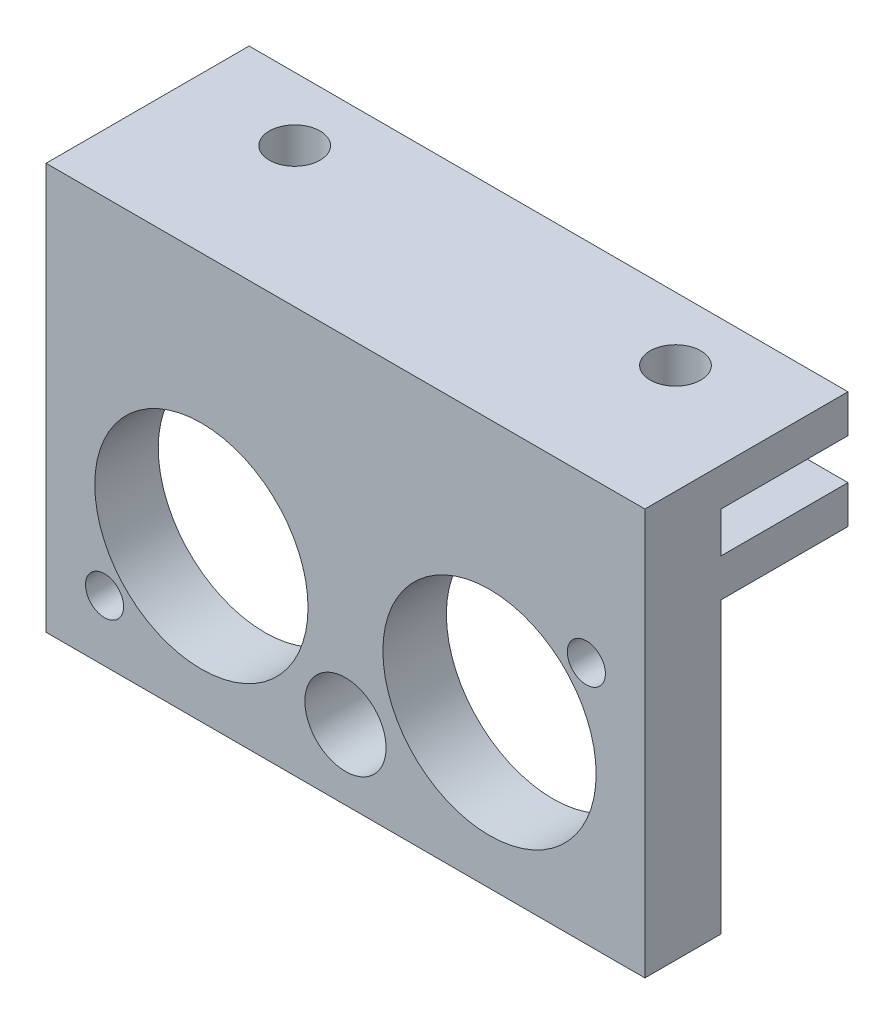
ISO-10303-21;
HEADER;
FILE_DESCRIPTION(('STEP AP214'),'2;1');
FILE_NAME('part.step','',(''),(''),'','','');
FILE_SCHEMA(('AUTOMOTIVE_DESIGN { 1 0 10303 214 1 1 1 1 }'));
ENDSEC;
DATA;
#1=APPLICATION_CONTEXT('core data for automotive mechanical design processes');
#2=APPLICATION_PROTOCOL_DEFINITION('international standard','automotive_design',2000,#1);
#3=PRODUCT_CONTEXT('',#1,'mechanical');
#4=PRODUCT('Part','Part','',(#3));
#5=PRODUCT_RELATED_PRODUCT_CATEGORY('part','',(#4));
#6=PRODUCT_DEFINITION_FORMATION('','',#4);
#7=PRODUCT_DEFINITION_CONTEXT('part definition',#1,'design');
#8=PRODUCT_DEFINITION('design','',#6,#7);
#9=PRODUCT_DEFINITION_SHAPE('','',#8);
#10=(LENGTH_UNIT() NAMED_UNIT(*) SI_UNIT(.MILLI.,.METRE.));
#11=(NAMED_UNIT(*) PLANE_ANGLE_UNIT() SI_UNIT($,.RADIAN.));
#12=(NAMED_UNIT(*) SI_UNIT($,.STERADIAN.) SOLID_ANGLE_UNIT());
#13=UNCERTAINTY_MEASURE_WITH_UNIT(LENGTH_MEASURE(1.E-05),#10,'distance_accuracy_value','');
#14=(GEOMETRIC_REPRESENTATION_CONTEXT(3) GLOBAL_UNCERTAINTY_ASSIGNED_CONTEXT((#13)) GLOBAL_UNIT_ASSIGNED_CONTEXT((#10,
#11,#12)) REPRESENTATION_CONTEXT('',''));
#15=CARTESIAN_POINT('',(0.,0.,0.));
#16=DIRECTION('',(0.,0.,1.));
#17=DIRECTION('',(1.,0.,0.));
#18=AXIS2_PLACEMENT_3D('',#15,#16,#17);
#19=CARTESIAN_POINT('',(-86.1189313630636,-26.6187031008466,2.482219341433E-13));
#20=DIRECTION('',(0.,0.,1.));
#21=DIRECTION('',(1.,0.,0.));
#22=AXIS2_PLACEMENT_3D('',#19,#20,#21);
#23=PLANE('',#22);
#24=DIRECTION('',(1.,0.,0.));
#25=VECTOR('',#24,1.);
#26=CARTESIAN_POINT('',(-88.1189313630636,-2.81870310084656,0.));
#27=LINE('',#26,#25);
#28=CARTESIAN_POINT('',(-54.5289313630636,-2.81870310084656,0.));
#29=VERTEX_POINT('',#28);
#30=CARTESIAN_POINT('',(-40.9389313630636,-2.81870310084656,2.48666185319545E-13));
#31=VERTEX_POINT('',#30);
#32=EDGE_CURVE('E365',#29,#31,#27,.T.);
#33=ORIENTED_EDGE('',*,*,#32,.F.);
#34=DIRECTION('',(0.,1.,0.));
#35=VECTOR('',#34,1.);
#36=CARTESIAN_POINT('',(-54.5289313630636,-26.6187031008466,2.482219341433E-13));
#37=LINE('',#36,#35);
#38=CARTESIAN_POINT('',(-54.5289313630636,0.381296899153442,0.));
#39=VERTEX_POINT('',#38);
#40=EDGE_CURVE('E460',#29,#39,#37,.T.);
#41=ORIENTED_EDGE('',*,*,#40,.T.);
#42=DIRECTION('',(-1.,0.,0.));
#43=VECTOR('',#42,1.);
#44=CARTESIAN_POINT('',(-40.9389313630636,0.381296899153443,0.));
#45=LINE('',#44,#43);
#46=CARTESIAN_POINT('',(-40.9389313630636,0.381296899153442,2.48666185319545E-13));
#47=VERTEX_POINT('',#46);
#48=EDGE_CURVE('E385',#47,#39,#45,.T.);
#49=ORIENTED_EDGE('',*,*,#48,.F.);
#50=DIRECTION('',(0.,-1.,0.));
#51=VECTOR('',#50,1.);
#52=CARTESIAN_POINT('',(-40.9389313630636,-28.6187031008466,2.48666185319545E-13));
#53=LINE('',#52,#51);
#54=EDGE_CURVE('E312',#47,#31,#53,.T.);
#55=ORIENTED_EDGE('',*,*,#54,.T.);
#56=EDGE_LOOP('',(#33,#41,#49,#55));
#57=FACE_BOUND('',#56,.T.);
#58=ADVANCED_FACE('F33',(#57),#23,.F.);
#59=CARTESIAN_POINT('',(-86.3189313630636,-6.41870310084656,-48.1183582429822));
#60=DIRECTION('',(0.,-1.,0.));
#61=DIRECTION('',(0.,0.,-1.));
#62=AXIS2_PLACEMENT_3D('',#59,#60,#61);
#63=PLANE('',#62);
#64=DIRECTION('',(0.,0.,1.));
#65=VECTOR('',#64,1.);
#66=CARTESIAN_POINT('',(-54.5289313630636,-6.41870310084656,1.00000000000025));
#67=LINE('',#66,#65);
#68=CARTESIAN_POINT('',(-54.5289313630636,-6.41870310084656,2.4980018054066E-13));
#69=VERTEX_POINT('',#68);
#70=CARTESIAN_POINT('',(-54.5289313630636,-6.41870310084656,1.00000000000025));
#71=VERTEX_POINT('',#70);
#72=EDGE_CURVE('E208',#69,#71,#67,.T.);
#73=ORIENTED_EDGE('',*,*,#72,.F.);
#74=DIRECTION('',(-1.,0.,0.));
#75=VECTOR('',#74,1.);
#76=CARTESIAN_POINT('',(-86.3189313630636,-6.41870310084656,2.48666185319545E-13));
#77=LINE('',#76,#75);
#78=CARTESIAN_POINT('',(-42.7389313630636,-6.41870310084656,2.48666185319545E-13));
#79=VERTEX_POINT('',#78);
#80=EDGE_CURVE('E410',#79,#69,#77,.T.);
#81=ORIENTED_EDGE('',*,*,#80,.F.);
#82=DIRECTION('',(0.,0.,1.));
#83=VECTOR('',#82,1.);
#84=CARTESIAN_POINT('',(-42.7389313630636,-6.41870310084656,-48.1183582429822));
#85=LINE('',#84,#83);
#86=CARTESIAN_POINT('',(-42.7389313630636,-6.41870310084656,1.00000000000025));
#87=VERTEX_POINT('',#86);
#88=EDGE_CURVE('E233',#79,#87,#85,.T.);
#89=ORIENTED_EDGE('',*,*,#88,.T.);
#90=DIRECTION('',(1.,0.,0.));
#91=VECTOR('',#90,1.);
#92=CARTESIAN_POINT('',(-86.3189313630636,-6.41870310084656,1.00000000000025));
#93=LINE('',#92,#91);
#94=EDGE_CURVE('E225',#71,#87,#93,.T.);
#95=ORIENTED_EDGE('',*,*,#94,.F.);
#96=EDGE_LOOP('',(#73,#81,#89,#95));
#97=FACE_BOUND('',#96,.T.);
#98=ADVANCED_FACE('F231',(#97),#63,.T.);
#99=CARTESIAN_POINT('',(-88.1189313630636,-2.81870310084656,-10.));
#100=DIRECTION('',(0.,-1.,0.));
#101=DIRECTION('',(1.,0.,0.));
#102=AXIS2_PLACEMENT_3D('',#99,#100,#101);
#103=PLANE('',#102);
#104=CARTESIAN_POINT('',(-49.5289313630636,-2.81870310084656,-4.99999999999999));
#105=DIRECTION('',(0.,-1.,0.));
#106=DIRECTION('',(1.,0.,0.));
#107=AXIS2_PLACEMENT_3D('',#104,#105,#106);
#108=CIRCLE('',#107,2.);
#109=CARTESIAN_POINT('',(-47.5289313630636,-2.81870310084656,-4.99999999999999));
#110=VERTEX_POINT('',#109);
#111=EDGE_CURVE('E479',#110,#110,#108,.T.);
#112=ORIENTED_EDGE('',*,*,#111,.T.);
#113=EDGE_LOOP('',(#112));
#114=FACE_BOUND('',#113,.T.);
#115=DIRECTION('',(1.,0.,0.));
#116=VECTOR('',#115,1.);
#117=CARTESIAN_POINT('',(-88.1189313630636,-2.81870310084656,-10.));
#118=LINE('',#117,#116);
#119=CARTESIAN_POINT('',(-54.5289313630636,-2.81870310084655,-9.99999999999999));
#120=VERTEX_POINT('',#119);
#121=CARTESIAN_POINT('',(-40.9389313630636,-2.81870310084656,-10.));
#122=VERTEX_POINT('',#121);
#123=EDGE_CURVE('E487',#120,#122,#118,.T.);
#124=ORIENTED_EDGE('',*,*,#123,.F.);
#125=DIRECTION('',(0.,0.,1.));
#126=VECTOR('',#125,1.);
#127=CARTESIAN_POINT('',(-54.5289313630636,-2.81870310084656,-10.));
#128=LINE('',#127,#126);
#129=EDGE_CURVE('E457',#120,#29,#128,.T.);
#130=ORIENTED_EDGE('',*,*,#129,.T.);
#131=ORIENTED_EDGE('',*,*,#32,.T.);
#132=DIRECTION('',(0.,0.,1.));
#133=VECTOR('',#132,1.);
#134=CARTESIAN_POINT('',(-40.9389313630636,-2.81870310084656,-10.));
#135=LINE('',#134,#133);
#136=EDGE_CURVE('E374',#122,#31,#135,.T.);
#137=ORIENTED_EDGE('',*,*,#136,.F.);
#138=EDGE_LOOP('',(#124,#130,#131,#137));
#139=FACE_BOUND('',#138,.T.);
#140=ADVANCED_FACE('F495',(#114,#139),#103,.F.);
#141=CARTESIAN_POINT('',(-88.1189313630636,-5.81870310084656,-10.));
#142=DIRECTION('',(0.,1.,0.));
#143=DIRECTION('',(-1.,0.,0.));
#144=AXIS2_PLACEMENT_3D('',#141,#142,#143);
#145=PLANE('',#144);
#146=CARTESIAN_POINT('',(-49.5289313630636,-5.81870310084656,-4.99999999999999));
#147=DIRECTION('',(0.,-1.,0.));
#148=DIRECTION('',(1.,0.,0.));
#149=AXIS2_PLACEMENT_3D('',#146,#147,#148);
#150=CIRCLE('',#149,2.);
#151=CARTESIAN_POINT('',(-47.5289313630636,-5.81870310084656,-4.99999999999999));
#152=VERTEX_POINT('',#151);
#153=EDGE_CURVE('E475',#152,#152,#150,.T.);
#154=ORIENTED_EDGE('',*,*,#153,.F.);
#155=EDGE_LOOP('',(#154));
#156=FACE_BOUND('',#155,.T.);
#157=DIRECTION('',(-1.,0.,0.));
#158=VECTOR('',#157,1.);
#159=CARTESIAN_POINT('',(-88.1189313630636,-5.81870310084656,0.));
#160=LINE('',#159,#158);
#161=CARTESIAN_POINT('',(-40.9389313630636,-5.81870310084656,0.));
#162=VERTEX_POINT('',#161);
#163=CARTESIAN_POINT('',(-54.5289313630636,-5.81870310084656,0.));
#164=VERTEX_POINT('',#163);
#165=EDGE_CURVE('E366',#162,#164,#160,.T.);
#166=ORIENTED_EDGE('',*,*,#165,.T.);
#167=DIRECTION('',(0.,0.,-1.));
#168=VECTOR('',#167,1.);
#169=CARTESIAN_POINT('',(-54.5289313630636,-5.81870310084656,-10.));
#170=LINE('',#169,#168);
#171=CARTESIAN_POINT('',(-54.5289313630636,-5.81870310084655,-9.99999999999999));
#172=VERTEX_POINT('',#171);
#173=EDGE_CURVE('E453',#164,#172,#170,.T.);
#174=ORIENTED_EDGE('',*,*,#173,.T.);
#175=DIRECTION('',(-1.,0.,0.));
#176=VECTOR('',#175,1.);
#177=CARTESIAN_POINT('',(-88.1189313630636,-5.81870310084656,-10.));
#178=LINE('',#177,#176);
#179=CARTESIAN_POINT('',(-40.9389313630636,-5.81870310084656,-10.));
#180=VERTEX_POINT('',#179);
#181=EDGE_CURVE('E356',#180,#172,#178,.T.);
#182=ORIENTED_EDGE('',*,*,#181,.F.);
#183=DIRECTION('',(0.,0.,1.));
#184=VECTOR('',#183,1.);
#185=CARTESIAN_POINT('',(-40.9389313630636,-5.81870310084656,-10.));
#186=LINE('',#185,#184);
#187=EDGE_CURVE('E371',#180,#162,#186,.T.);
#188=ORIENTED_EDGE('',*,*,#187,.T.);
#189=EDGE_LOOP('',(#166,#174,#182,#188));
#190=FACE_BOUND('',#189,.T.);
#191=ADVANCED_FACE('F504',(#156,#190),#145,.F.);
#192=CARTESIAN_POINT('',(0.,0.,-10.));
#193=DIRECTION('',(0.,0.,1.));
#194=DIRECTION('',(1.,0.,0.));
#195=AXIS2_PLACEMENT_3D('',#192,#193,#194);
#196=PLANE('',#195);
#197=ORIENTED_EDGE('',*,*,#181,.T.);
#198=DIRECTION('',(0.,1.,0.));
#199=VECTOR('',#198,1.);
#200=CARTESIAN_POINT('',(-54.5289313630636,0.,-10.));
#201=LINE('',#200,#199);
#202=EDGE_CURVE('E11',#172,#120,#201,.T.);
#203=ORIENTED_EDGE('',*,*,#202,.T.);
#204=ORIENTED_EDGE('',*,*,#123,.T.);
#205=DIRECTION('',(0.,-1.,0.));
#206=VECTOR('',#205,1.);
#207=CARTESIAN_POINT('',(-40.9389313630636,-2.81870310084656,-10.));
#208=LINE('',#207,#206);
#209=EDGE_CURVE('E357',#122,#180,#208,.T.);
#210=ORIENTED_EDGE('',*,*,#209,.T.);
#211=EDGE_LOOP('',(#197,#203,#204,#210));
#212=FACE_BOUND('',#211,.T.);
#213=ADVANCED_FACE('F491',(#212),#196,.F.);
#214=CARTESIAN_POINT('',(-74.5289313630636,0.381296899153442,0.));
#215=VERTEX_POINT('',#214);
#216=CARTESIAN_POINT('',(-88.1189313630636,0.381296899153442,0.));
#217=VERTEX_POINT('',#216);
#218=EDGE_CURVE('E380',#215,#217,#45,.T.);
#219=ORIENTED_EDGE('',*,*,#218,.F.);
#220=DIRECTION('',(0.,-1.,0.));
#221=VECTOR('',#220,1.);
#222=CARTESIAN_POINT('',(-74.5289313630636,-26.6187031008466,2.482219341433E-13));
#223=LINE('',#222,#221);
#224=CARTESIAN_POINT('',(-74.5289313630636,-2.81870310084656,0.));
#225=VERTEX_POINT('',#224);
#226=EDGE_CURVE('E451',#215,#225,#223,.T.);
#227=ORIENTED_EDGE('',*,*,#226,.T.);
#228=CARTESIAN_POINT('',(-88.1189313630636,-2.81870310084656,2.48666185319545E-13));
#229=VERTEX_POINT('',#228);
#230=EDGE_CURVE('E56',#229,#225,#27,.T.);
#231=ORIENTED_EDGE('',*,*,#230,.F.);
#232=DIRECTION('',(0.,1.,0.));
#233=VECTOR('',#232,1.);
#234=CARTESIAN_POINT('',(-88.1189313630636,-28.6187031008466,2.48666185319545E-13));
#235=LINE('',#234,#233);
#236=EDGE_CURVE('E315',#229,#217,#235,.T.);
#237=ORIENTED_EDGE('',*,*,#236,.T.);
#238=EDGE_LOOP('',(#219,#227,#231,#237));
#239=FACE_BOUND('',#238,.T.);
#240=ADVANCED_FACE('F520',(#239),#23,.F.);
#241=ORIENTED_EDGE('',*,*,#80,.T.);
#242=DIRECTION('',(0.,1.,0.));
#243=VECTOR('',#242,1.);
#244=CARTESIAN_POINT('',(-54.5289313630636,-26.6187031008466,2.482219341433E-13));
#245=LINE('',#244,#243);
#246=EDGE_CURVE('E213',#69,#164,#245,.T.);
#247=ORIENTED_EDGE('',*,*,#246,.T.);
#248=ORIENTED_EDGE('',*,*,#165,.F.);
#249=CARTESIAN_POINT('',(-40.9389313630636,-28.6187031008466,2.3478839751173E-13));
#250=VERTEX_POINT('',#249);
#251=EDGE_CURVE('E316',#162,#250,#53,.T.);
#252=ORIENTED_EDGE('',*,*,#251,.T.);
#253=DIRECTION('',(-1.,0.,0.));
#254=VECTOR('',#253,1.);
#255=CARTESIAN_POINT('',(-88.1189313630636,-28.6187031008466,2.48666185319545E-13));
#256=LINE('',#255,#254);
#257=CARTESIAN_POINT('',(-88.1189313630636,-28.6187031008466,2.48666185319545E-13));
#258=VERTEX_POINT('',#257);
#259=EDGE_CURVE('E320',#250,#258,#256,.T.);
#260=ORIENTED_EDGE('',*,*,#259,.T.);
#261=CARTESIAN_POINT('',(-88.1189313630636,-5.81870310084656,2.48666185319545E-13));
#262=VERTEX_POINT('',#261);
#263=EDGE_CURVE('E317',#258,#262,#235,.T.);
#264=ORIENTED_EDGE('',*,*,#263,.T.);
#265=CARTESIAN_POINT('',(-74.5289313630636,-5.81870310084656,0.));
#266=VERTEX_POINT('',#265);
#267=EDGE_CURVE('E364',#266,#262,#160,.T.);
#268=ORIENTED_EDGE('',*,*,#267,.F.);
#269=DIRECTION('',(0.,-1.,0.));
#270=VECTOR('',#269,1.);
#271=CARTESIAN_POINT('',(-74.5289313630636,-26.6187031008466,2.482219341433E-13));
#272=LINE('',#271,#270);
#273=CARTESIAN_POINT('',(-74.5289313630636,-6.41870310084656,2.4980018054066E-13));
#274=VERTEX_POINT('',#273);
#275=EDGE_CURVE('E446',#266,#274,#272,.T.);
#276=ORIENTED_EDGE('',*,*,#275,.T.);
#277=CARTESIAN_POINT('',(-86.3189313630636,-6.41870310084656,2.48666185319545E-13));
#278=VERTEX_POINT('',#277);
#279=EDGE_CURVE('E256',#274,#278,#77,.T.);
#280=ORIENTED_EDGE('',*,*,#279,.T.);
#281=DIRECTION('',(0.,-1.,0.));
#282=VECTOR('',#281,1.);
#283=CARTESIAN_POINT('',(-86.3189313630636,-26.8187031008466,2.48666185319545E-13));
#284=LINE('',#283,#282);
#285=CARTESIAN_POINT('',(-86.3189313630636,-26.8187031008466,2.48666185319545E-13));
#286=VERTEX_POINT('',#285);
#287=EDGE_CURVE('E412',#278,#286,#284,.T.);
#288=ORIENTED_EDGE('',*,*,#287,.T.);
#289=DIRECTION('',(1.,0.,0.));
#290=VECTOR('',#289,1.);
#291=CARTESIAN_POINT('',(-42.7389313630636,-26.8187031008466,2.48666185319545E-13));
#292=LINE('',#291,#290);
#293=CARTESIAN_POINT('',(-42.7389313630636,-26.8187031008466,2.482219341433E-13));
#294=VERTEX_POINT('',#293);
#295=EDGE_CURVE('E269',#286,#294,#292,.T.);
#296=ORIENTED_EDGE('',*,*,#295,.T.);
#297=DIRECTION('',(0.,1.,0.));
#298=VECTOR('',#297,1.);
#299=CARTESIAN_POINT('',(-42.7389313630636,-6.41870310084656,2.48666185319545E-13));
#300=LINE('',#299,#298);
#301=EDGE_CURVE('E253',#294,#79,#300,.T.);
#302=ORIENTED_EDGE('',*,*,#301,.T.);
#303=EDGE_LOOP('',(#241,#247,#248,#252,#260,#264,#268,#276,#280,#288,#296,#302));
#304=FACE_BOUND('',#303,.T.);
#305=ADVANCED_FACE('F506',(#304),#23,.F.);
#306=CARTESIAN_POINT('',(-45.5486784669612,-9.41870310084656,6.00000000000025));
#307=DIRECTION('',(0.,0.,-1.));
#308=DIRECTION('',(-1.,0.,0.));
#309=AXIS2_PLACEMENT_3D('',#306,#307,#308);
#310=CYLINDRICAL_SURFACE('',#309,1.5);
#311=CARTESIAN_POINT('',(-45.5486784669612,-9.41870310084656,6.00000000000025));
#312=DIRECTION('',(0.,0.,-1.));
#313=DIRECTION('',(-1.,0.,0.));
#314=AXIS2_PLACEMENT_3D('',#311,#312,#313);
#315=CIRCLE('',#314,1.5);
#316=CARTESIAN_POINT('',(-47.0486784669612,-9.41870310084656,6.00000000000025));
#317=VERTEX_POINT('',#316);
#318=EDGE_CURVE('E301',#317,#317,#315,.T.);
#319=ORIENTED_EDGE('',*,*,#318,.F.);
#320=EDGE_LOOP('',(#319));
#321=FACE_BOUND('',#320,.T.);
#322=CARTESIAN_POINT('',(-45.5486784669612,-9.41870310084656,1.00000000000025));
#323=DIRECTION('',(0.,0.,-1.));
#324=DIRECTION('',(-1.,0.,0.));
#325=AXIS2_PLACEMENT_3D('',#322,#323,#324);
#326=CIRCLE('',#325,1.5);
#327=CARTESIAN_POINT('',(-47.0486784669612,-9.41870310084656,1.00000000000025));
#328=VERTEX_POINT('',#327);
#329=EDGE_CURVE('E290',#328,#328,#326,.F.);
#330=ORIENTED_EDGE('',*,*,#329,.F.);
#331=EDGE_LOOP('',(#330));
#332=FACE_BOUND('',#331,.T.);
#333=ADVANCED_FACE('F528',(#321,#332),#310,.F.);
#334=CARTESIAN_POINT('',(-83.5091842591659,-23.8187031008466,6.00000000000025));
#335=DIRECTION('',(0.,0.,-1.));
#336=DIRECTION('',(-1.,0.,0.));
#337=AXIS2_PLACEMENT_3D('',#334,#335,#336);
#338=CYLINDRICAL_SURFACE('',#337,1.5);
#339=CARTESIAN_POINT('',(-83.5091842591659,-23.8187031008466,6.00000000000025));
#340=DIRECTION('',(0.,0.,-1.));
#341=DIRECTION('',(-1.,0.,0.));
#342=AXIS2_PLACEMENT_3D('',#339,#340,#341);
#343=CIRCLE('',#342,1.5);
#344=CARTESIAN_POINT('',(-85.0091842591659,-23.8187031008466,6.00000000000025));
#345=VERTEX_POINT('',#344);
#346=EDGE_CURVE('E307',#345,#345,#343,.T.);
#347=ORIENTED_EDGE('',*,*,#346,.F.);
#348=EDGE_LOOP('',(#347));
#349=FACE_BOUND('',#348,.T.);
#350=CARTESIAN_POINT('',(-83.5091842591659,-23.8187031008466,1.00000000000025));
#351=DIRECTION('',(0.,0.,-1.));
#352=DIRECTION('',(-1.,0.,0.));
#353=AXIS2_PLACEMENT_3D('',#350,#351,#352);
#354=CIRCLE('',#353,1.5);
#355=CARTESIAN_POINT('',(-85.0091842591659,-23.8187031008466,1.00000000000025));
#356=VERTEX_POINT('',#355);
#357=EDGE_CURVE('E291',#356,#356,#354,.F.);
#358=ORIENTED_EDGE('',*,*,#357,.F.);
#359=EDGE_LOOP('',(#358));
#360=FACE_BOUND('',#359,.T.);
#361=ADVANCED_FACE('F639',(#349,#360),#338,.F.);
#362=CARTESIAN_POINT('',(-88.1189313630636,-28.6187031008466,-52.9334714523804));
#363=DIRECTION('',(-1.,0.,0.));
#364=DIRECTION('',(0.,0.,1.));
#365=AXIS2_PLACEMENT_3D('',#362,#363,#364);
#366=PLANE('',#365);
#367=ORIENTED_EDGE('',*,*,#263,.F.);
#368=DIRECTION('',(0.,0.,1.));
#369=VECTOR('',#368,1.);
#370=CARTESIAN_POINT('',(-88.1189313630636,-28.6187031008466,-52.9334714523804));
#371=LINE('',#370,#369);
#372=CARTESIAN_POINT('',(-88.1189313630636,-28.6187031008466,6.00000000000025));
#373=VERTEX_POINT('',#372);
#374=EDGE_CURVE('E328',#258,#373,#371,.T.);
#375=ORIENTED_EDGE('',*,*,#374,.T.);
#376=DIRECTION('',(0.,-1.,0.));
#377=VECTOR('',#376,1.);
#378=CARTESIAN_POINT('',(-88.1189313630636,-28.6187031008466,6.00000000000025));
#379=LINE('',#378,#377);
#380=CARTESIAN_POINT('',(-88.1189313630636,3.38129689915344,6.00000000000025));
#381=VERTEX_POINT('',#380);
#382=EDGE_CURVE('E310',#381,#373,#379,.T.);
#383=ORIENTED_EDGE('',*,*,#382,.F.);
#384=DIRECTION('',(0.,0.,1.));
#385=VECTOR('',#384,1.);
#386=CARTESIAN_POINT('',(-88.1189313630636,3.38129689915344,-47.8534471067652));
#387=LINE('',#386,#385);
#388=CARTESIAN_POINT('',(-88.1189313630636,3.38129689915344,-10.));
#389=VERTEX_POINT('',#388);
#390=EDGE_CURVE('E405',#389,#381,#387,.T.);
#391=ORIENTED_EDGE('',*,*,#390,.F.);
#392=DIRECTION('',(0.,1.,0.));
#393=VECTOR('',#392,1.);
#394=CARTESIAN_POINT('',(-88.1189313630636,3.38129689915344,-10.));
#395=LINE('',#394,#393);
#396=CARTESIAN_POINT('',(-88.1189313630636,0.381296899153442,-10.));
#397=VERTEX_POINT('',#396);
#398=EDGE_CURVE('E387',#397,#389,#395,.T.);
#399=ORIENTED_EDGE('',*,*,#398,.F.);
#400=DIRECTION('',(0.,0.,1.));
#401=VECTOR('',#400,1.);
#402=CARTESIAN_POINT('',(-88.1189313630636,0.381296899153442,-10.));
#403=LINE('',#402,#401);
#404=EDGE_CURVE('E393',#397,#217,#403,.T.);
#405=ORIENTED_EDGE('',*,*,#404,.T.);
#406=ORIENTED_EDGE('',*,*,#236,.F.);
#407=DIRECTION('',(0.,0.,1.));
#408=VECTOR('',#407,1.);
#409=CARTESIAN_POINT('',(-88.1189313630636,-2.81870310084656,-10.));
#410=LINE('',#409,#408);
#411=CARTESIAN_POINT('',(-88.1189313630636,-2.81870310084656,-10.));
#412=VERTEX_POINT('',#411);
#413=EDGE_CURVE('E377',#412,#229,#410,.T.);
#414=ORIENTED_EDGE('',*,*,#413,.F.);
#415=DIRECTION('',(0.,1.,0.));
#416=VECTOR('',#415,1.);
#417=CARTESIAN_POINT('',(-88.1189313630636,-2.81870310084656,-10.));
#418=LINE('',#417,#416);
#419=CARTESIAN_POINT('',(-88.1189313630636,-5.81870310084656,-10.));
#420=VERTEX_POINT('',#419);
#421=EDGE_CURVE('E369',#420,#412,#418,.T.);
#422=ORIENTED_EDGE('',*,*,#421,.F.);
#423=DIRECTION('',(0.,0.,1.));
#424=VECTOR('',#423,1.);
#425=CARTESIAN_POINT('',(-88.1189313630636,-5.81870310084656,-10.));
#426=LINE('',#425,#424);
#427=EDGE_CURVE('E354',#420,#262,#426,.T.);
#428=ORIENTED_EDGE('',*,*,#427,.T.);
#429=EDGE_LOOP('',(#367,#375,#383,#391,#399,#405,#406,#414,#422,#428));
#430=FACE_BOUND('',#429,.T.);
#431=ADVANCED_FACE('F35',(#430),#366,.T.);
#432=CARTESIAN_POINT('',(-40.9389313630636,-28.6187031008466,-52.9334714523804));
#433=DIRECTION('',(1.,0.,0.));
#434=DIRECTION('',(0.,0.,-1.));
#435=AXIS2_PLACEMENT_3D('',#432,#433,#434);
#436=PLANE('',#435);
#437=ORIENTED_EDGE('',*,*,#54,.F.);
#438=DIRECTION('',(0.,0.,1.));
#439=VECTOR('',#438,1.);
#440=CARTESIAN_POINT('',(-40.9389313630636,0.381296899153443,-10.));
#441=LINE('',#440,#439);
#442=CARTESIAN_POINT('',(-40.9389313630636,0.381296899153443,-10.));
#443=VERTEX_POINT('',#442);
#444=EDGE_CURVE('E398',#443,#47,#441,.T.);
#445=ORIENTED_EDGE('',*,*,#444,.F.);
#446=DIRECTION('',(0.,-1.,0.));
#447=VECTOR('',#446,1.);
#448=CARTESIAN_POINT('',(-40.9389313630636,3.38129689915344,-10.));
#449=LINE('',#448,#447);
#450=CARTESIAN_POINT('',(-40.9389313630636,3.38129689915344,-10.));
#451=VERTEX_POINT('',#450);
#452=EDGE_CURVE('E381',#451,#443,#449,.T.);
#453=ORIENTED_EDGE('',*,*,#452,.F.);
#454=DIRECTION('',(0.,0.,1.));
#455=VECTOR('',#454,1.);
#456=CARTESIAN_POINT('',(-40.9389313630636,3.38129689915344,-47.8534471067652));
#457=LINE('',#456,#455);
#458=CARTESIAN_POINT('',(-40.9389313630636,3.38129689915344,6.00000000000025));
#459=VERTEX_POINT('',#458);
#460=EDGE_CURVE('E404',#451,#459,#457,.T.);
#461=ORIENTED_EDGE('',*,*,#460,.T.);
#462=DIRECTION('',(0.,1.,0.));
#463=VECTOR('',#462,1.);
#464=CARTESIAN_POINT('',(-40.9389313630636,-28.6187031008466,6.00000000000025));
#465=LINE('',#464,#463);
#466=CARTESIAN_POINT('',(-40.9389313630636,-28.6187031008466,6.00000000000025));
#467=VERTEX_POINT('',#466);
#468=EDGE_CURVE('E326',#467,#459,#465,.T.);
#469=ORIENTED_EDGE('',*,*,#468,.F.);
#470=DIRECTION('',(0.,0.,1.));
#471=VECTOR('',#470,1.);
#472=CARTESIAN_POINT('',(-40.9389313630636,-28.6187031008466,-52.9334714523804));
#473=LINE('',#472,#471);
#474=EDGE_CURVE('E329',#250,#467,#473,.T.);
#475=ORIENTED_EDGE('',*,*,#474,.F.);
#476=ORIENTED_EDGE('',*,*,#251,.F.);
#477=ORIENTED_EDGE('',*,*,#187,.F.);
#478=ORIENTED_EDGE('',*,*,#209,.F.);
#479=ORIENTED_EDGE('',*,*,#136,.T.);
#480=EDGE_LOOP('',(#437,#445,#453,#461,#469,#475,#476,#477,#478,#479));
#481=FACE_BOUND('',#480,.T.);
#482=ADVANCED_FACE('F499',(#481),#436,.T.);
#483=CARTESIAN_POINT('',(-88.1189313630636,-28.6187031008466,-52.9334714523804));
#484=DIRECTION('',(0.,-1.,0.));
#485=DIRECTION('',(0.,0.,-1.));
#486=AXIS2_PLACEMENT_3D('',#483,#484,#485);
#487=PLANE('',#486);
#488=ORIENTED_EDGE('',*,*,#259,.F.);
#489=ORIENTED_EDGE('',*,*,#474,.T.);
#490=DIRECTION('',(1.,0.,0.));
#491=VECTOR('',#490,1.);
#492=CARTESIAN_POINT('',(-88.1189313630636,-28.6187031008466,6.00000000000025));
#493=LINE('',#492,#491);
#494=EDGE_CURVE('E323',#373,#467,#493,.T.);
#495=ORIENTED_EDGE('',*,*,#494,.F.);
#496=ORIENTED_EDGE('',*,*,#374,.F.);
#497=EDGE_LOOP('',(#488,#489,#495,#496));
#498=FACE_BOUND('',#497,.T.);
#499=ADVANCED_FACE('F552',(#498),#487,.T.);
#500=CARTESIAN_POINT('',(-13.7204387637204,-5.79974003466205,6.00000000000025));
#501=DIRECTION('',(0.,0.,-1.));
#502=DIRECTION('',(-1.,0.,0.));
#503=AXIS2_PLACEMENT_3D('',#500,#501,#502);
#504=PLANE('',#503);
#505=CARTESIAN_POINT('',(-53.1789313630635,-16.6187031008466,6.00000000000025));
#506=DIRECTION('',(0.,0.,-1.));
#507=DIRECTION('',(-1.,0.,0.));
#508=AXIS2_PLACEMENT_3D('',#505,#506,#507);
#509=CIRCLE('',#508,8.4);
#510=CARTESIAN_POINT('',(-61.5789313630636,-16.6187031008466,6.00000000000025));
#511=VERTEX_POINT('',#510);
#512=EDGE_CURVE('E294',#511,#511,#509,.T.);
#513=ORIENTED_EDGE('',*,*,#512,.T.);
#514=EDGE_LOOP('',(#513));
#515=FACE_BOUND('',#514,.T.);
#516=CARTESIAN_POINT('',(-75.8789313630636,-16.6187031008466,6.00000000000025));
#517=DIRECTION('',(0.,0.,-1.));
#518=DIRECTION('',(-1.,0.,0.));
#519=AXIS2_PLACEMENT_3D('',#516,#517,#518);
#520=CIRCLE('',#519,8.4);
#521=CARTESIAN_POINT('',(-84.2789313630636,-16.6187031008466,6.00000000000025));
#522=VERTEX_POINT('',#521);
#523=EDGE_CURVE('E295',#522,#522,#520,.T.);
#524=ORIENTED_EDGE('',*,*,#523,.T.);
#525=EDGE_LOOP('',(#524));
#526=FACE_BOUND('',#525,.T.);
#527=CARTESIAN_POINT('',(-64.5289313630636,-23.1187031008466,6.00000000000025));
#528=DIRECTION('',(0.,0.,-1.));
#529=DIRECTION('',(-1.,0.,0.));
#530=AXIS2_PLACEMENT_3D('',#527,#528,#529);
#531=CIRCLE('',#530,3.2);
#532=CARTESIAN_POINT('',(-67.7289313630636,-23.1187031008466,6.00000000000025));
#533=VERTEX_POINT('',#532);
#534=EDGE_CURVE('E298',#533,#533,#531,.T.);
#535=ORIENTED_EDGE('',*,*,#534,.T.);
#536=EDGE_LOOP('',(#535));
#537=FACE_BOUND('',#536,.T.);
#538=ORIENTED_EDGE('',*,*,#318,.T.);
#539=EDGE_LOOP('',(#538));
#540=FACE_BOUND('',#539,.T.);
#541=ORIENTED_EDGE('',*,*,#346,.T.);
#542=EDGE_LOOP('',(#541));
#543=FACE_BOUND('',#542,.T.);
#544=ORIENTED_EDGE('',*,*,#382,.T.);
#545=ORIENTED_EDGE('',*,*,#494,.T.);
#546=ORIENTED_EDGE('',*,*,#468,.T.);
#547=DIRECTION('',(-1.,0.,0.));
#548=VECTOR('',#547,1.);
#549=CARTESIAN_POINT('',(-88.1189313630636,3.38129689915344,6.00000000000025));
#550=LINE('',#549,#548);
#551=EDGE_CURVE('E401',#459,#381,#550,.T.);
#552=ORIENTED_EDGE('',*,*,#551,.T.);
#553=EDGE_LOOP('',(#544,#545,#546,#552));
#554=FACE_BOUND('',#553,.T.);
#555=ADVANCED_FACE('F549',(#515,#526,#537,#540,#543,#554),#504,.F.);
#556=CARTESIAN_POINT('',(-86.1189313630636,-26.6187031008466,1.00000000000025));
#557=DIRECTION('',(0.,0.,1.));
#558=DIRECTION('',(1.,0.,0.));
#559=AXIS2_PLACEMENT_3D('',#556,#557,#558);
#560=PLANE('',#559);
#561=DIRECTION('',(0.,-1.,0.));
#562=VECTOR('',#561,1.);
#563=CARTESIAN_POINT('',(-58.4489313630636,-8.95390140454284,1.00000000000025));
#564=LINE('',#563,#562);
#565=CARTESIAN_POINT('',(-58.4489313630636,-6.95390140454284,1.00000000000025));
#566=VERTEX_POINT('',#565);
#567=CARTESIAN_POINT('',(-58.4489313630636,-8.95390140454284,1.00000000000025));
#568=VERTEX_POINT('',#567);
#569=EDGE_CURVE('E260',#566,#568,#564,.T.);
#570=ORIENTED_EDGE('',*,*,#569,.F.);
#571=DIRECTION('',(1.,0.,0.));
#572=VECTOR('',#571,1.);
#573=CARTESIAN_POINT('',(-70.6089313630636,-6.95390140454284,1.00000000000025));
#574=LINE('',#573,#572);
#575=CARTESIAN_POINT('',(-70.6089313630636,-6.95390140454284,1.00000000000025));
#576=VERTEX_POINT('',#575);
#577=EDGE_CURVE('E263',#576,#566,#574,.T.);
#578=ORIENTED_EDGE('',*,*,#577,.F.);
#579=DIRECTION('',(0.,1.,0.));
#580=VECTOR('',#579,1.);
#581=CARTESIAN_POINT('',(-70.6089313630636,-8.95390140454284,1.00000000000025));
#582=LINE('',#581,#580);
#583=CARTESIAN_POINT('',(-70.6089313630636,-8.95390140454284,1.00000000000025));
#584=VERTEX_POINT('',#583);
#585=EDGE_CURVE('E266',#584,#576,#582,.T.);
#586=ORIENTED_EDGE('',*,*,#585,.F.);
#587=DIRECTION('',(-1.,0.,0.));
#588=VECTOR('',#587,1.);
#589=CARTESIAN_POINT('',(-70.6089313630636,-8.95390140454284,1.00000000000025));
#590=LINE('',#589,#588);
#591=EDGE_CURVE('E257',#568,#584,#590,.T.);
#592=ORIENTED_EDGE('',*,*,#591,.F.);
#593=EDGE_LOOP('',(#570,#578,#586,#592));
#594=FACE_BOUND('',#593,.T.);
#595=CARTESIAN_POINT('',(-75.8789313630636,-16.6187031008466,1.00000000000025));
#596=DIRECTION('',(0.,0.,1.));
#597=DIRECTION('',(1.,0.,0.));
#598=AXIS2_PLACEMENT_3D('',#595,#596,#597);
#599=CIRCLE('',#598,8.4);
#600=CARTESIAN_POINT('',(-67.4789313630636,-16.6187031008466,1.00000000000025));
#601=VERTEX_POINT('',#600);
#602=EDGE_CURVE('E335',#601,#601,#599,.T.);
#603=ORIENTED_EDGE('',*,*,#602,.T.);
#604=EDGE_LOOP('',(#603));
#605=FACE_BOUND('',#604,.T.);
#606=CARTESIAN_POINT('',(-53.1789313630635,-16.6187031008466,1.00000000000025));
#607=DIRECTION('',(0.,0.,1.));
#608=DIRECTION('',(1.,0.,0.));
#609=AXIS2_PLACEMENT_3D('',#606,#607,#608);
#610=CIRCLE('',#609,8.4);
#611=CARTESIAN_POINT('',(-44.7789313630635,-16.6187031008466,1.00000000000025));
#612=VERTEX_POINT('',#611);
#613=EDGE_CURVE('E311',#612,#612,#610,.T.);
#614=ORIENTED_EDGE('',*,*,#613,.T.);
#615=EDGE_LOOP('',(#614));
#616=FACE_BOUND('',#615,.T.);
#617=CARTESIAN_POINT('',(-64.5289313630636,-23.1187031008466,1.00000000000025));
#618=DIRECTION('',(0.,0.,1.));
#619=DIRECTION('',(1.,0.,0.));
#620=AXIS2_PLACEMENT_3D('',#617,#618,#619);
#621=CIRCLE('',#620,3.2);
#622=CARTESIAN_POINT('',(-61.3289313630636,-23.1187031008466,1.00000000000025));
#623=VERTEX_POINT('',#622);
#624=EDGE_CURVE('E304',#623,#623,#621,.T.);
#625=ORIENTED_EDGE('',*,*,#624,.T.);
#626=EDGE_LOOP('',(#625));
#627=FACE_BOUND('',#626,.T.);
#628=ORIENTED_EDGE('',*,*,#357,.T.);
#629=EDGE_LOOP('',(#628));
#630=FACE_BOUND('',#629,.T.);
#631=ORIENTED_EDGE('',*,*,#329,.T.);
#632=EDGE_LOOP('',(#631));
#633=FACE_BOUND('',#632,.T.);
#634=DIRECTION('',(-1.,0.,0.));
#635=VECTOR('',#634,1.);
#636=CARTESIAN_POINT('',(-42.7389313630636,-26.8187031008466,1.00000000000025));
#637=LINE('',#636,#635);
#638=CARTESIAN_POINT('',(-42.7389313630636,-26.8187031008466,1.00000000000025));
#639=VERTEX_POINT('',#638);
#640=CARTESIAN_POINT('',(-86.3189313630636,-26.8187031008466,1.00000000000025));
#641=VERTEX_POINT('',#640);
#642=EDGE_CURVE('E241',#639,#641,#637,.T.);
#643=ORIENTED_EDGE('',*,*,#642,.T.);
#644=DIRECTION('',(0.,1.,0.));
#645=VECTOR('',#644,1.);
#646=CARTESIAN_POINT('',(-86.3189313630636,-26.8187031008466,1.00000000000025));
#647=LINE('',#646,#645);
#648=CARTESIAN_POINT('',(-86.3189313630636,-6.41870310084656,1.00000000000025));
#649=VERTEX_POINT('',#648);
#650=EDGE_CURVE('E236',#641,#649,#647,.T.);
#651=ORIENTED_EDGE('',*,*,#650,.T.);
#652=CARTESIAN_POINT('',(-74.5289313630636,-6.41870310084656,1.00000000000025));
#653=VERTEX_POINT('',#652);
#654=EDGE_CURVE('E235',#649,#653,#93,.T.);
#655=ORIENTED_EDGE('',*,*,#654,.T.);
#656=DIRECTION('',(0.,-1.,0.));
#657=VECTOR('',#656,1.);
#658=CARTESIAN_POINT('',(-74.5289313630636,23.2067213201802,1.00000000000025));
#659=LINE('',#658,#657);
#660=CARTESIAN_POINT('',(-74.5289313630636,0.381296899153442,1.00000000000025));
#661=VERTEX_POINT('',#660);
#662=EDGE_CURVE('E431',#661,#653,#659,.T.);
#663=ORIENTED_EDGE('',*,*,#662,.F.);
#664=DIRECTION('',(-1.,0.,0.));
#665=VECTOR('',#664,1.);
#666=CARTESIAN_POINT('',(-74.5289313630636,0.381296899153442,1.00000000000025));
#667=LINE('',#666,#665);
#668=CARTESIAN_POINT('',(-54.5289313630636,0.381296899153442,1.00000000000025));
#669=VERTEX_POINT('',#668);
#670=EDGE_CURVE('E229',#669,#661,#667,.T.);
#671=ORIENTED_EDGE('',*,*,#670,.F.);
#672=DIRECTION('',(0.,-1.,0.));
#673=VECTOR('',#672,1.);
#674=CARTESIAN_POINT('',(-54.5289313630636,23.2067213201802,1.00000000000025));
#675=LINE('',#674,#673);
#676=EDGE_CURVE('E211',#669,#71,#675,.T.);
#677=ORIENTED_EDGE('',*,*,#676,.T.);
#678=ORIENTED_EDGE('',*,*,#94,.T.);
#679=DIRECTION('',(0.,-1.,0.));
#680=VECTOR('',#679,1.);
#681=CARTESIAN_POINT('',(-42.7389313630636,-6.41870310084656,1.00000000000025));
#682=LINE('',#681,#680);
#683=EDGE_CURVE('E239',#87,#639,#682,.T.);
#684=ORIENTED_EDGE('',*,*,#683,.T.);
#685=EDGE_LOOP('',(#643,#651,#655,#663,#671,#677,#678,#684));
#686=FACE_BOUND('',#685,.T.);
#687=ADVANCED_FACE('F223',(#594,#605,#616,#627,#630,#633,#686),#560,.F.);
#688=CARTESIAN_POINT('',(-64.5289313630636,-23.1187031008466,6.00000000000025));
#689=DIRECTION('',(0.,0.,-1.));
#690=DIRECTION('',(-1.,0.,0.));
#691=AXIS2_PLACEMENT_3D('',#688,#689,#690);
#692=CYLINDRICAL_SURFACE('',#691,3.2);
#693=ORIENTED_EDGE('',*,*,#534,.F.);
#694=EDGE_LOOP('',(#693));
#695=FACE_BOUND('',#694,.T.);
#696=ORIENTED_EDGE('',*,*,#624,.F.);
#697=EDGE_LOOP('',(#696));
#698=FACE_BOUND('',#697,.T.);
#699=ADVANCED_FACE('F632',(#695,#698),#692,.F.);
#700=CARTESIAN_POINT('',(-75.8789313630636,-16.6187031008466,6.00000000000025));
#701=DIRECTION('',(0.,0.,-1.));
#702=DIRECTION('',(-1.,0.,0.));
#703=AXIS2_PLACEMENT_3D('',#700,#701,#702);
#704=CYLINDRICAL_SURFACE('',#703,8.4);
#705=ORIENTED_EDGE('',*,*,#523,.F.);
#706=EDGE_LOOP('',(#705));
#707=FACE_BOUND('',#706,.T.);
#708=ORIENTED_EDGE('',*,*,#602,.F.);
#709=EDGE_LOOP('',(#708));
#710=FACE_BOUND('',#709,.T.);
#711=ADVANCED_FACE('F629',(#707,#710),#704,.F.);
#712=CARTESIAN_POINT('',(-53.1789313630635,-16.6187031008466,6.00000000000025));
#713=DIRECTION('',(0.,0.,-1.));
#714=DIRECTION('',(-1.,0.,0.));
#715=AXIS2_PLACEMENT_3D('',#712,#713,#714);
#716=CYLINDRICAL_SURFACE('',#715,8.4);
#717=ORIENTED_EDGE('',*,*,#512,.F.);
#718=EDGE_LOOP('',(#717));
#719=FACE_BOUND('',#718,.T.);
#720=ORIENTED_EDGE('',*,*,#613,.F.);
#721=EDGE_LOOP('',(#720));
#722=FACE_BOUND('',#721,.T.);
#723=ADVANCED_FACE('F627',(#719,#722),#716,.F.);
#724=CARTESIAN_POINT('',(-70.6089313630636,-6.95390140454284,14.823376160777));
#725=DIRECTION('',(0.,1.,0.));
#726=DIRECTION('',(-1.,0.,0.));
#727=AXIS2_PLACEMENT_3D('',#724,#725,#726);
#728=PLANE('',#727);
#729=DIRECTION('',(0.,0.,-1.));
#730=VECTOR('',#729,1.);
#731=CARTESIAN_POINT('',(-70.6089313630636,-6.95390140454284,14.823376160777));
#732=LINE('',#731,#730);
#733=CARTESIAN_POINT('',(-70.6089313630636,-6.95390140454284,2.50000000000025));
#734=VERTEX_POINT('',#733);
#735=EDGE_CURVE('E276',#734,#576,#732,.T.);
#736=ORIENTED_EDGE('',*,*,#735,.T.);
#737=ORIENTED_EDGE('',*,*,#577,.T.);
#738=DIRECTION('',(0.,0.,-1.));
#739=VECTOR('',#738,1.);
#740=CARTESIAN_POINT('',(-58.4489313630636,-6.95390140454284,14.823376160777));
#741=LINE('',#740,#739);
#742=CARTESIAN_POINT('',(-58.4489313630636,-6.95390140454284,2.50000000000025));
#743=VERTEX_POINT('',#742);
#744=EDGE_CURVE('E272',#743,#566,#741,.T.);
#745=ORIENTED_EDGE('',*,*,#744,.F.);
#746=DIRECTION('',(1.,0.,0.));
#747=VECTOR('',#746,1.);
#748=CARTESIAN_POINT('',(-70.6089313630636,-6.95390140454284,2.50000000000025));
#749=LINE('',#748,#747);
#750=EDGE_CURVE('E259',#734,#743,#749,.T.);
#751=ORIENTED_EDGE('',*,*,#750,.F.);
#752=EDGE_LOOP('',(#736,#737,#745,#751));
#753=FACE_BOUND('',#752,.T.);
#754=ADVANCED_FACE('F623',(#753),#728,.F.);
#755=CARTESIAN_POINT('',(-58.4489313630636,-8.95390140454284,14.823376160777));
#756=DIRECTION('',(1.,0.,0.));
#757=DIRECTION('',(0.,0.,-1.));
#758=AXIS2_PLACEMENT_3D('',#755,#756,#757);
#759=PLANE('',#758);
#760=ORIENTED_EDGE('',*,*,#744,.T.);
#761=ORIENTED_EDGE('',*,*,#569,.T.);
#762=DIRECTION('',(0.,0.,-1.));
#763=VECTOR('',#762,1.);
#764=CARTESIAN_POINT('',(-58.4489313630636,-8.95390140454284,14.823376160777));
#765=LINE('',#764,#763);
#766=CARTESIAN_POINT('',(-58.4489313630636,-8.95390140454284,2.50000000000025));
#767=VERTEX_POINT('',#766);
#768=EDGE_CURVE('E281',#767,#568,#765,.T.);
#769=ORIENTED_EDGE('',*,*,#768,.F.);
#770=DIRECTION('',(0.,-1.,0.));
#771=VECTOR('',#770,1.);
#772=CARTESIAN_POINT('',(-58.4489313630636,-8.95390140454284,2.50000000000025));
#773=LINE('',#772,#771);
#774=EDGE_CURVE('E282',#743,#767,#773,.T.);
#775=ORIENTED_EDGE('',*,*,#774,.F.);
#776=EDGE_LOOP('',(#760,#761,#769,#775));
#777=FACE_BOUND('',#776,.T.);
#778=ADVANCED_FACE('F619',(#777),#759,.F.);
#779=CARTESIAN_POINT('',(-70.6089313630636,-8.95390140454284,14.823376160777));
#780=DIRECTION('',(0.,-1.,0.));
#781=DIRECTION('',(1.,0.,0.));
#782=AXIS2_PLACEMENT_3D('',#779,#780,#781);
#783=PLANE('',#782);
#784=ORIENTED_EDGE('',*,*,#768,.T.);
#785=ORIENTED_EDGE('',*,*,#591,.T.);
#786=DIRECTION('',(0.,0.,-1.));
#787=VECTOR('',#786,1.);
#788=CARTESIAN_POINT('',(-70.6089313630636,-8.95390140454284,14.823376160777));
#789=LINE('',#788,#787);
#790=CARTESIAN_POINT('',(-70.6089313630636,-8.95390140454284,2.50000000000025));
#791=VERTEX_POINT('',#790);
#792=EDGE_CURVE('E277',#791,#584,#789,.T.);
#793=ORIENTED_EDGE('',*,*,#792,.F.);
#794=DIRECTION('',(-1.,0.,0.));
#795=VECTOR('',#794,1.);
#796=CARTESIAN_POINT('',(-70.6089313630636,-8.95390140454284,2.50000000000025));
#797=LINE('',#796,#795);
#798=EDGE_CURVE('E278',#767,#791,#797,.T.);
#799=ORIENTED_EDGE('',*,*,#798,.F.);
#800=EDGE_LOOP('',(#784,#785,#793,#799));
#801=FACE_BOUND('',#800,.T.);
#802=ADVANCED_FACE('F615',(#801),#783,.F.);
#803=CARTESIAN_POINT('',(-70.6089313630636,-8.95390140454284,14.823376160777));
#804=DIRECTION('',(-1.,0.,0.));
#805=DIRECTION('',(0.,0.,1.));
#806=AXIS2_PLACEMENT_3D('',#803,#804,#805);
#807=PLANE('',#806);
#808=ORIENTED_EDGE('',*,*,#792,.T.);
#809=ORIENTED_EDGE('',*,*,#585,.T.);
#810=ORIENTED_EDGE('',*,*,#735,.F.);
#811=DIRECTION('',(0.,1.,0.));
#812=VECTOR('',#811,1.);
#813=CARTESIAN_POINT('',(-70.6089313630636,-8.95390140454284,2.50000000000025));
#814=LINE('',#813,#812);
#815=EDGE_CURVE('E273',#791,#734,#814,.T.);
#816=ORIENTED_EDGE('',*,*,#815,.F.);
#817=EDGE_LOOP('',(#808,#809,#810,#816));
#818=FACE_BOUND('',#817,.T.);
#819=ADVANCED_FACE('F612',(#818),#807,.F.);
#820=CARTESIAN_POINT('',(-69.8788364204263,-8.21481067244,2.50000000000025));
#821=DIRECTION('',(0.,0.,1.));
#822=DIRECTION('',(1.,0.,0.));
#823=AXIS2_PLACEMENT_3D('',#820,#821,#822);
#824=PLANE('',#823);
#825=ORIENTED_EDGE('',*,*,#815,.T.);
#826=ORIENTED_EDGE('',*,*,#750,.T.);
#827=ORIENTED_EDGE('',*,*,#774,.T.);
#828=ORIENTED_EDGE('',*,*,#798,.T.);
#829=EDGE_LOOP('',(#825,#826,#827,#828));
#830=FACE_BOUND('',#829,.T.);
#831=ADVANCED_FACE('F605',(#830),#824,.F.);
#832=CARTESIAN_POINT('',(-42.7389313630636,-6.41870310084656,-48.1183582429822));
#833=DIRECTION('',(-1.,0.,0.));
#834=DIRECTION('',(0.,0.,1.));
#835=AXIS2_PLACEMENT_3D('',#832,#833,#834);
#836=PLANE('',#835);
#837=DIRECTION('',(0.,0.,1.));
#838=VECTOR('',#837,1.);
#839=CARTESIAN_POINT('',(-42.7389313630636,-26.8187031008466,-48.1183582429822));
#840=LINE('',#839,#838);
#841=EDGE_CURVE('E246',#294,#639,#840,.T.);
#842=ORIENTED_EDGE('',*,*,#841,.T.);
#843=ORIENTED_EDGE('',*,*,#683,.F.);
#844=ORIENTED_EDGE('',*,*,#88,.F.);
#845=ORIENTED_EDGE('',*,*,#301,.F.);
#846=EDGE_LOOP('',(#842,#843,#844,#845));
#847=FACE_BOUND('',#846,.T.);
#848=ADVANCED_FACE('F508',(#847),#836,.T.);
#849=DIRECTION('',(0.,0.,-1.));
#850=VECTOR('',#849,1.);
#851=CARTESIAN_POINT('',(-74.5289313630636,-6.41870310084656,1.00000000000025));
#852=LINE('',#851,#850);
#853=EDGE_CURVE('E218',#653,#274,#852,.T.);
#854=ORIENTED_EDGE('',*,*,#853,.F.);
#855=ORIENTED_EDGE('',*,*,#654,.F.);
#856=DIRECTION('',(0.,0.,1.));
#857=VECTOR('',#856,1.);
#858=CARTESIAN_POINT('',(-86.3189313630636,-6.41870310084656,-48.1183582429822));
#859=LINE('',#858,#857);
#860=EDGE_CURVE('E249',#278,#649,#859,.T.);
#861=ORIENTED_EDGE('',*,*,#860,.F.);
#862=ORIENTED_EDGE('',*,*,#279,.F.);
#863=EDGE_LOOP('',(#854,#855,#861,#862));
#864=FACE_BOUND('',#863,.T.);
#865=ADVANCED_FACE('F430',(#864),#63,.T.);
#866=CARTESIAN_POINT('',(-86.3189313630636,-26.8187031008466,-48.1183582429822));
#867=DIRECTION('',(1.,0.,0.));
#868=DIRECTION('',(0.,0.,-1.));
#869=AXIS2_PLACEMENT_3D('',#866,#867,#868);
#870=PLANE('',#869);
#871=ORIENTED_EDGE('',*,*,#860,.T.);
#872=ORIENTED_EDGE('',*,*,#650,.F.);
#873=DIRECTION('',(0.,0.,1.));
#874=VECTOR('',#873,1.);
#875=CARTESIAN_POINT('',(-86.3189313630636,-26.8187031008466,-48.1183582429822));
#876=LINE('',#875,#874);
#877=EDGE_CURVE('E251',#286,#641,#876,.T.);
#878=ORIENTED_EDGE('',*,*,#877,.F.);
#879=ORIENTED_EDGE('',*,*,#287,.F.);
#880=EDGE_LOOP('',(#871,#872,#878,#879));
#881=FACE_BOUND('',#880,.T.);
#882=ADVANCED_FACE('F425',(#881),#870,.T.);
#883=CARTESIAN_POINT('',(-42.7389313630636,-26.8187031008466,-48.1183582429822));
#884=DIRECTION('',(0.,1.,0.));
#885=DIRECTION('',(0.,0.,1.));
#886=AXIS2_PLACEMENT_3D('',#883,#884,#885);
#887=PLANE('',#886);
#888=ORIENTED_EDGE('',*,*,#877,.T.);
#889=ORIENTED_EDGE('',*,*,#642,.F.);
#890=ORIENTED_EDGE('',*,*,#841,.F.);
#891=ORIENTED_EDGE('',*,*,#295,.F.);
#892=EDGE_LOOP('',(#888,#889,#890,#891));
#893=FACE_BOUND('',#892,.T.);
#894=ADVANCED_FACE('F420',(#893),#887,.T.);
#895=CARTESIAN_POINT('',(-88.1189313630636,3.38129689915344,-47.8534471067652));
#896=DIRECTION('',(0.,1.,0.));
#897=DIRECTION('',(0.,0.,1.));
#898=AXIS2_PLACEMENT_3D('',#895,#896,#897);
#899=PLANE('',#898);
#900=CARTESIAN_POINT('',(-79.5289313630636,3.38129689915345,-5.));
#901=DIRECTION('',(0.,-1.,0.));
#902=DIRECTION('',(1.,0.,0.));
#903=AXIS2_PLACEMENT_3D('',#900,#901,#902);
#904=CIRCLE('',#903,2.);
#905=CARTESIAN_POINT('',(-77.5289313630636,3.38129689915345,-5.));
#906=VERTEX_POINT('',#905);
#907=EDGE_CURVE('E464',#906,#906,#904,.T.);
#908=ORIENTED_EDGE('',*,*,#907,.T.);
#909=EDGE_LOOP('',(#908));
#910=FACE_BOUND('',#909,.T.);
#911=CARTESIAN_POINT('',(-49.5289313630636,3.38129689915344,-4.99999999999999));
#912=DIRECTION('',(0.,-1.,0.));
#913=DIRECTION('',(1.,0.,0.));
#914=AXIS2_PLACEMENT_3D('',#911,#912,#913);
#915=CIRCLE('',#914,2.);
#916=CARTESIAN_POINT('',(-47.5289313630636,3.38129689915344,-4.99999999999999));
#917=VERTEX_POINT('',#916);
#918=EDGE_CURVE('E476',#917,#917,#915,.T.);
#919=ORIENTED_EDGE('',*,*,#918,.T.);
#920=EDGE_LOOP('',(#919));
#921=FACE_BOUND('',#920,.T.);
#922=ORIENTED_EDGE('',*,*,#460,.F.);
#923=DIRECTION('',(1.,0.,0.));
#924=VECTOR('',#923,1.);
#925=CARTESIAN_POINT('',(-40.9389313630636,3.38129689915344,-10.));
#926=LINE('',#925,#924);
#927=EDGE_CURVE('E390',#389,#451,#926,.T.);
#928=ORIENTED_EDGE('',*,*,#927,.F.);
#929=ORIENTED_EDGE('',*,*,#390,.T.);
#930=ORIENTED_EDGE('',*,*,#551,.F.);
#931=EDGE_LOOP('',(#922,#928,#929,#930));
#932=FACE_BOUND('',#931,.T.);
#933=ADVANCED_FACE('F542',(#910,#921,#932),#899,.T.);
#934=CARTESIAN_POINT('',(-40.9389313630636,0.381296899153443,-10.));
#935=DIRECTION('',(0.,1.,0.));
#936=DIRECTION('',(-1.,0.,0.));
#937=AXIS2_PLACEMENT_3D('',#934,#935,#936);
#938=PLANE('',#937);
#939=CARTESIAN_POINT('',(-79.5289313630636,0.381296899153442,-5.));
#940=DIRECTION('',(0.,1.,0.));
#941=DIRECTION('',(-1.,0.,0.));
#942=AXIS2_PLACEMENT_3D('',#939,#940,#941);
#943=CIRCLE('',#942,2.);
#944=CARTESIAN_POINT('',(-81.5289313630636,0.381296899153442,-5.));
#945=VERTEX_POINT('',#944);
#946=EDGE_CURVE('E472',#945,#945,#943,.T.);
#947=ORIENTED_EDGE('',*,*,#946,.T.);
#948=EDGE_LOOP('',(#947));
#949=FACE_BOUND('',#948,.T.);
#950=ORIENTED_EDGE('',*,*,#404,.F.);
#951=DIRECTION('',(-1.,0.,0.));
#952=VECTOR('',#951,1.);
#953=CARTESIAN_POINT('',(-40.9389313630636,0.381296899153443,-10.));
#954=LINE('',#953,#952);
#955=EDGE_CURVE('E384',#443,#397,#954,.T.);
#956=ORIENTED_EDGE('',*,*,#955,.F.);
#957=ORIENTED_EDGE('',*,*,#444,.T.);
#958=ORIENTED_EDGE('',*,*,#48,.T.);
#959=DIRECTION('',(0.,0.,1.));
#960=VECTOR('',#959,1.);
#961=CARTESIAN_POINT('',(-54.5289313630636,0.381296899153442,1.00000000000025));
#962=LINE('',#961,#960);
#963=EDGE_CURVE('E217',#39,#669,#962,.T.);
#964=ORIENTED_EDGE('',*,*,#963,.T.);
#965=ORIENTED_EDGE('',*,*,#670,.T.);
#966=DIRECTION('',(0.,0.,-1.));
#967=VECTOR('',#966,1.);
#968=CARTESIAN_POINT('',(-74.5289313630636,0.381296899153442,1.00000000000025));
#969=LINE('',#968,#967);
#970=EDGE_CURVE('E432',#661,#215,#969,.T.);
#971=ORIENTED_EDGE('',*,*,#970,.T.);
#972=ORIENTED_EDGE('',*,*,#218,.T.);
#973=EDGE_LOOP('',(#950,#956,#957,#958,#964,#965,#971,#972));
#974=FACE_BOUND('',#973,.T.);
#975=CARTESIAN_POINT('',(-49.5289313630636,0.381296899153443,-4.99999999999999));
#976=DIRECTION('',(0.,1.,0.));
#977=DIRECTION('',(-1.,0.,0.));
#978=AXIS2_PLACEMENT_3D('',#975,#976,#977);
#979=CIRCLE('',#978,2.);
#980=CARTESIAN_POINT('',(-51.5289313630636,0.381296899153443,-4.99999999999999));
#981=VERTEX_POINT('',#980);
#982=EDGE_CURVE('E484',#981,#981,#979,.T.);
#983=ORIENTED_EDGE('',*,*,#982,.T.);
#984=EDGE_LOOP('',(#983));
#985=FACE_BOUND('',#984,.T.);
#986=ADVANCED_FACE('F437',(#949,#974,#985),#938,.F.);
#987=CARTESIAN_POINT('',(0.,0.,-10.));
#988=DIRECTION('',(0.,0.,-1.));
#989=DIRECTION('',(-1.,0.,0.));
#990=AXIS2_PLACEMENT_3D('',#987,#988,#989);
#991=PLANE('',#990);
#992=ORIENTED_EDGE('',*,*,#452,.T.);
#993=ORIENTED_EDGE('',*,*,#955,.T.);
#994=ORIENTED_EDGE('',*,*,#398,.T.);
#995=ORIENTED_EDGE('',*,*,#927,.T.);
#996=EDGE_LOOP('',(#992,#993,#994,#995));
#997=FACE_BOUND('',#996,.T.);
#998=ADVANCED_FACE('F539',(#997),#991,.T.);
#999=CARTESIAN_POINT('',(-79.5289313630636,-2.81870310084656,-5.));
#1000=DIRECTION('',(0.,-1.,0.));
#1001=DIRECTION('',(1.,0.,0.));
#1002=AXIS2_PLACEMENT_3D('',#999,#1000,#1001);
#1003=CIRCLE('',#1002,2.);
#1004=CARTESIAN_POINT('',(-77.5289313630636,-2.81870310084656,-5.));
#1005=VERTEX_POINT('',#1004);
#1006=EDGE_CURVE('E467',#1005,#1005,#1003,.T.);
#1007=ORIENTED_EDGE('',*,*,#1006,.T.);
#1008=EDGE_LOOP('',(#1007));
#1009=FACE_BOUND('',#1008,.T.);
#1010=ORIENTED_EDGE('',*,*,#230,.T.);
#1011=DIRECTION('',(0.,0.,-1.));
#1012=VECTOR('',#1011,1.);
#1013=CARTESIAN_POINT('',(-74.5289313630636,-2.81870310084656,-10.));
#1014=LINE('',#1013,#1012);
#1015=CARTESIAN_POINT('',(-74.5289313630636,-2.81870310084655,-9.99999999999999));
#1016=VERTEX_POINT('',#1015);
#1017=EDGE_CURVE('E449',#225,#1016,#1014,.T.);
#1018=ORIENTED_EDGE('',*,*,#1017,.T.);
#1019=EDGE_CURVE('E348',#412,#1016,#118,.T.);
#1020=ORIENTED_EDGE('',*,*,#1019,.F.);
#1021=ORIENTED_EDGE('',*,*,#413,.T.);
#1022=EDGE_LOOP('',(#1010,#1018,#1020,#1021));
#1023=FACE_BOUND('',#1022,.T.);
#1024=ADVANCED_FACE('F555',(#1009,#1023),#103,.F.);
#1025=CARTESIAN_POINT('',(-79.5289313630636,-5.81870310084656,-5.));
#1026=DIRECTION('',(0.,-1.,0.));
#1027=DIRECTION('',(1.,0.,0.));
#1028=AXIS2_PLACEMENT_3D('',#1025,#1026,#1027);
#1029=CIRCLE('',#1028,2.);
#1030=CARTESIAN_POINT('',(-77.5289313630636,-5.81870310084656,-5.));
#1031=VERTEX_POINT('',#1030);
#1032=EDGE_CURVE('E463',#1031,#1031,#1029,.T.);
#1033=ORIENTED_EDGE('',*,*,#1032,.F.);
#1034=EDGE_LOOP('',(#1033));
#1035=FACE_BOUND('',#1034,.T.);
#1036=CARTESIAN_POINT('',(-74.5289313630636,-5.81870310084656,-10.));
#1037=VERTEX_POINT('',#1036);
#1038=EDGE_CURVE('E346',#1037,#420,#178,.T.);
#1039=ORIENTED_EDGE('',*,*,#1038,.F.);
#1040=DIRECTION('',(0.,0.,1.));
#1041=VECTOR('',#1040,1.);
#1042=CARTESIAN_POINT('',(-74.5289313630636,-5.81870310084656,-10.));
#1043=LINE('',#1042,#1041);
#1044=EDGE_CURVE('E48',#1037,#266,#1043,.T.);
#1045=ORIENTED_EDGE('',*,*,#1044,.T.);
#1046=ORIENTED_EDGE('',*,*,#267,.T.);
#1047=ORIENTED_EDGE('',*,*,#427,.F.);
#1048=EDGE_LOOP('',(#1039,#1045,#1046,#1047));
#1049=FACE_BOUND('',#1048,.T.);
#1050=ADVANCED_FACE('F351',(#1035,#1049),#145,.F.);
#1051=ORIENTED_EDGE('',*,*,#1019,.T.);
#1052=DIRECTION('',(0.,-1.,0.));
#1053=VECTOR('',#1052,1.);
#1054=CARTESIAN_POINT('',(-74.5289313630636,0.,-10.));
#1055=LINE('',#1054,#1053);
#1056=EDGE_CURVE('E41',#1016,#1037,#1055,.T.);
#1057=ORIENTED_EDGE('',*,*,#1056,.T.);
#1058=ORIENTED_EDGE('',*,*,#1038,.T.);
#1059=ORIENTED_EDGE('',*,*,#421,.T.);
#1060=EDGE_LOOP('',(#1051,#1057,#1058,#1059));
#1061=FACE_BOUND('',#1060,.T.);
#1062=ADVANCED_FACE('F344',(#1061),#196,.F.);
#1063=CARTESIAN_POINT('',(-49.5289313630636,3.38129689915344,-4.99999999999999));
#1064=DIRECTION('',(0.,-1.,0.));
#1065=DIRECTION('',(1.,0.,0.));
#1066=AXIS2_PLACEMENT_3D('',#1063,#1064,#1065);
#1067=CYLINDRICAL_SURFACE('',#1066,2.);
#1068=ORIENTED_EDGE('',*,*,#153,.T.);
#1069=EDGE_LOOP('',(#1068));
#1070=FACE_BOUND('',#1069,.T.);
#1071=ORIENTED_EDGE('',*,*,#111,.F.);
#1072=EDGE_LOOP('',(#1071));
#1073=FACE_BOUND('',#1072,.T.);
#1074=ADVANCED_FACE('F574',(#1070,#1073),#1067,.F.);
#1075=ORIENTED_EDGE('',*,*,#918,.F.);
#1076=EDGE_LOOP('',(#1075));
#1077=FACE_BOUND('',#1076,.T.);
#1078=ORIENTED_EDGE('',*,*,#982,.F.);
#1079=EDGE_LOOP('',(#1078));
#1080=FACE_BOUND('',#1079,.T.);
#1081=ADVANCED_FACE('F576',(#1077,#1080),#1067,.F.);
#1082=CARTESIAN_POINT('',(-79.5289313630636,3.38129689915345,-5.));
#1083=DIRECTION('',(0.,-1.,0.));
#1084=DIRECTION('',(1.,0.,0.));
#1085=AXIS2_PLACEMENT_3D('',#1082,#1083,#1084);
#1086=CYLINDRICAL_SURFACE('',#1085,2.);
#1087=ORIENTED_EDGE('',*,*,#1032,.T.);
#1088=EDGE_LOOP('',(#1087));
#1089=FACE_BOUND('',#1088,.T.);
#1090=ORIENTED_EDGE('',*,*,#1006,.F.);
#1091=EDGE_LOOP('',(#1090));
#1092=FACE_BOUND('',#1091,.T.);
#1093=ADVANCED_FACE('F583',(#1089,#1092),#1086,.F.);
#1094=ORIENTED_EDGE('',*,*,#907,.F.);
#1095=EDGE_LOOP('',(#1094));
#1096=FACE_BOUND('',#1095,.T.);
#1097=ORIENTED_EDGE('',*,*,#946,.F.);
#1098=EDGE_LOOP('',(#1097));
#1099=FACE_BOUND('',#1098,.T.);
#1100=ADVANCED_FACE('F515',(#1096,#1099),#1086,.F.);
#1101=CARTESIAN_POINT('',(-54.5289313630636,23.2067213201802,1.00000000000025));
#1102=DIRECTION('',(1.,0.,0.));
#1103=DIRECTION('',(0.,1.,0.));
#1104=AXIS2_PLACEMENT_3D('',#1101,#1102,#1103);
#1105=PLANE('',#1104);
#1106=ORIENTED_EDGE('',*,*,#129,.F.);
#1107=ORIENTED_EDGE('',*,*,#202,.F.);
#1108=ORIENTED_EDGE('',*,*,#173,.F.);
#1109=ORIENTED_EDGE('',*,*,#246,.F.);
#1110=ORIENTED_EDGE('',*,*,#72,.T.);
#1111=ORIENTED_EDGE('',*,*,#676,.F.);
#1112=ORIENTED_EDGE('',*,*,#963,.F.);
#1113=ORIENTED_EDGE('',*,*,#40,.F.);
#1114=EDGE_LOOP('',(#1106,#1107,#1108,#1109,#1110,#1111,#1112,#1113));
#1115=FACE_BOUND('',#1114,.T.);
#1116=ADVANCED_FACE('F210',(#1115),#1105,.F.);
#1117=CARTESIAN_POINT('',(-74.5289313630636,23.2067213201802,1.00000000000025));
#1118=DIRECTION('',(-1.,0.,0.));
#1119=DIRECTION('',(0.,-1.,0.));
#1120=AXIS2_PLACEMENT_3D('',#1117,#1118,#1119);
#1121=PLANE('',#1120);
#1122=ORIENTED_EDGE('',*,*,#970,.F.);
#1123=ORIENTED_EDGE('',*,*,#662,.T.);
#1124=ORIENTED_EDGE('',*,*,#853,.T.);
#1125=ORIENTED_EDGE('',*,*,#275,.F.);
#1126=ORIENTED_EDGE('',*,*,#1044,.F.);
#1127=ORIENTED_EDGE('',*,*,#1056,.F.);
#1128=ORIENTED_EDGE('',*,*,#1017,.F.);
#1129=ORIENTED_EDGE('',*,*,#226,.F.);
#1130=EDGE_LOOP('',(#1122,#1123,#1124,#1125,#1126,#1127,#1128,#1129));
#1131=FACE_BOUND('',#1130,.T.);
#1132=ADVANCED_FACE('F509',(#1131),#1121,.F.);
#1133=CLOSED_SHELL('',(#58,#98,#140,#191,#213,#240,#305,#333,#361,#431,#482,#499,#555,#687,#699,
#711,#723,#754,#778,#802,#819,#831,#848,#865,#882,#894,#933,#986,#998,#1024,#1050,#1062,#1074,
#1081,#1093,#1100,#1116,#1132));
#1134=MANIFOLD_SOLID_BREP('B2',#1133);
#1135=ADVANCED_BREP_SHAPE_REPRESENTATION('',(#18,#1134),#14);
#1136=SHAPE_DEFINITION_REPRESENTATION(#9,#1135);
ENDSEC;
END-ISO-10303-21;
